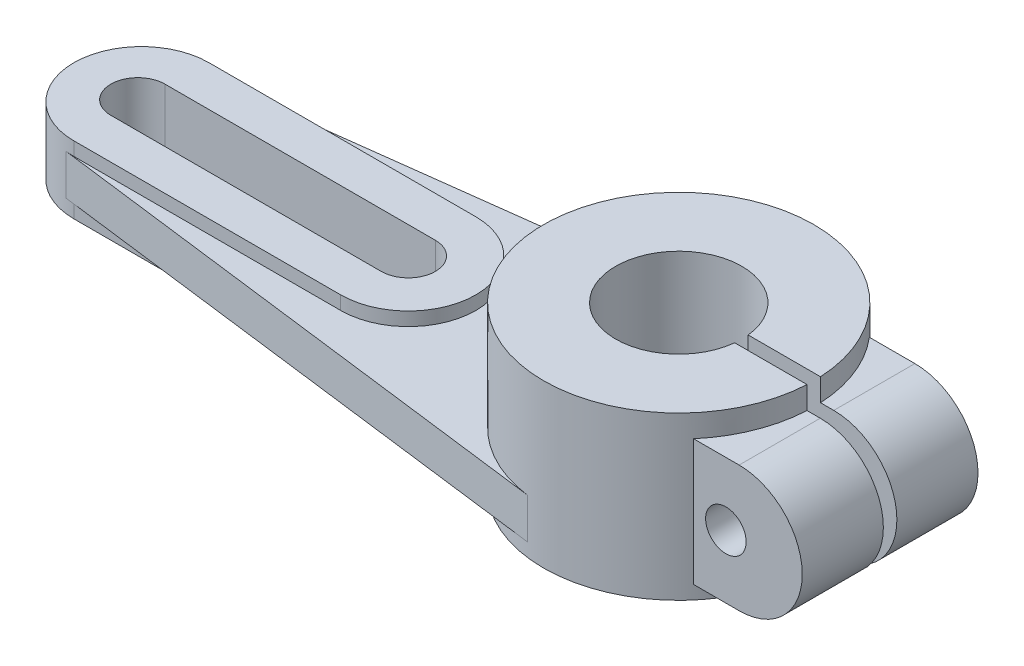
ISO-10303-21;
HEADER;
FILE_DESCRIPTION(('STEP AP214'),'2;1');
FILE_NAME('part.step','',(''),(''),'','','');
FILE_SCHEMA(('AUTOMOTIVE_DESIGN { 1 0 10303 214 1 1 1 1 }'));
ENDSEC;
DATA;
#1=APPLICATION_CONTEXT('core data for automotive mechanical design processes');
#2=APPLICATION_PROTOCOL_DEFINITION('international standard','automotive_design',2000,#1);
#3=PRODUCT_CONTEXT('',#1,'mechanical');
#4=PRODUCT('Part','Part','',(#3));
#5=PRODUCT_RELATED_PRODUCT_CATEGORY('part','',(#4));
#6=PRODUCT_DEFINITION_FORMATION('','',#4);
#7=PRODUCT_DEFINITION_CONTEXT('part definition',#1,'design');
#8=PRODUCT_DEFINITION('design','',#6,#7);
#9=PRODUCT_DEFINITION_SHAPE('','',#8);
#10=(LENGTH_UNIT() NAMED_UNIT(*) SI_UNIT(.MILLI.,.METRE.));
#11=(NAMED_UNIT(*) PLANE_ANGLE_UNIT() SI_UNIT($,.RADIAN.));
#12=(NAMED_UNIT(*) SI_UNIT($,.STERADIAN.) SOLID_ANGLE_UNIT());
#13=UNCERTAINTY_MEASURE_WITH_UNIT(LENGTH_MEASURE(1.E-05),#10,'distance_accuracy_value','');
#14=(GEOMETRIC_REPRESENTATION_CONTEXT(3) GLOBAL_UNCERTAINTY_ASSIGNED_CONTEXT((#13)) GLOBAL_UNIT_ASSIGNED_CONTEXT((#10,
#11,#12)) REPRESENTATION_CONTEXT('',''));
#15=CARTESIAN_POINT('',(0.,0.,0.));
#16=DIRECTION('',(0.,0.,1.));
#17=DIRECTION('',(1.,0.,0.));
#18=AXIS2_PLACEMENT_3D('',#15,#16,#17);
#19=CARTESIAN_POINT('',(32.9021558676946,9.5,-1.5));
#20=DIRECTION('',(0.,0.,1.));
#21=DIRECTION('',(1.,0.,0.));
#22=AXIS2_PLACEMENT_3D('',#19,#20,#21);
#23=CYLINDRICAL_SURFACE('',#22,14.);
#24=DIRECTION('',(0.,0.,1.));
#25=VECTOR('',#24,1.);
#26=CARTESIAN_POINT('',(32.9021558676946,23.5,0.));
#27=LINE('',#26,#25);
#28=CARTESIAN_POINT('',(32.9021558676946,23.5,-1.5));
#29=VERTEX_POINT('',#28);
#30=CARTESIAN_POINT('',(32.9021558676946,23.5,-19.5));
#31=VERTEX_POINT('',#30);
#32=EDGE_CURVE('E501',#29,#31,#27,.F.);
#33=ORIENTED_EDGE('',*,*,#32,.F.);
#34=CARTESIAN_POINT('',(32.9021558676946,9.5,-1.5));
#35=DIRECTION('',(0.,0.,-1.));
#36=DIRECTION('',(-1.,0.,0.));
#37=AXIS2_PLACEMENT_3D('',#34,#35,#36);
#38=CIRCLE('',#37,14.);
#39=CARTESIAN_POINT('',(32.9021558676946,-4.5,-1.5));
#40=VERTEX_POINT('',#39);
#41=EDGE_CURVE('E48',#40,#29,#38,.F.);
#42=ORIENTED_EDGE('',*,*,#41,.F.);
#43=DIRECTION('',(0.,0.,-1.));
#44=VECTOR('',#43,1.);
#45=CARTESIAN_POINT('',(32.9021558676946,-4.5,-1.5));
#46=LINE('',#45,#44);
#47=CARTESIAN_POINT('',(32.9021558676946,-4.5,-19.5));
#48=VERTEX_POINT('',#47);
#49=EDGE_CURVE('E505',#48,#40,#46,.F.);
#50=ORIENTED_EDGE('',*,*,#49,.F.);
#51=CARTESIAN_POINT('',(32.9021558676946,9.5,-19.5));
#52=DIRECTION('',(0.,0.,-1.));
#53=DIRECTION('',(-1.,0.,0.));
#54=AXIS2_PLACEMENT_3D('',#51,#52,#53);
#55=CIRCLE('',#54,14.);
#56=EDGE_CURVE('E11',#31,#48,#55,.T.);
#57=ORIENTED_EDGE('',*,*,#56,.F.);
#58=EDGE_LOOP('',(#33,#42,#50,#57));
#59=FACE_BOUND('',#58,.T.);
#60=ADVANCED_FACE('F38',(#59),#23,.T.);
#61=CARTESIAN_POINT('',(32.9021558676946,9.5,19.5));
#62=DIRECTION('',(0.,0.,-1.));
#63=DIRECTION('',(-1.,0.,0.));
#64=AXIS2_PLACEMENT_3D('',#61,#62,#63);
#65=CYLINDRICAL_SURFACE('',#64,14.);
#66=DIRECTION('',(0.,0.,1.));
#67=VECTOR('',#66,1.);
#68=CARTESIAN_POINT('',(32.9021558676946,23.5,19.5));
#69=LINE('',#68,#67);
#70=CARTESIAN_POINT('',(32.9021558676946,23.5,19.5));
#71=VERTEX_POINT('',#70);
#72=CARTESIAN_POINT('',(32.9021558676946,23.5,1.5));
#73=VERTEX_POINT('',#72);
#74=EDGE_CURVE('E476',#71,#73,#69,.F.);
#75=ORIENTED_EDGE('',*,*,#74,.F.);
#76=CARTESIAN_POINT('',(32.9021558676946,9.5,19.5));
#77=DIRECTION('',(0.,0.,-1.));
#78=DIRECTION('',(-1.,0.,0.));
#79=AXIS2_PLACEMENT_3D('',#76,#77,#78);
#80=CIRCLE('',#79,14.);
#81=CARTESIAN_POINT('',(32.9021558676946,-4.5,19.5));
#82=VERTEX_POINT('',#81);
#83=EDGE_CURVE('E495',#82,#71,#80,.F.);
#84=ORIENTED_EDGE('',*,*,#83,.F.);
#85=DIRECTION('',(0.,0.,-1.));
#86=VECTOR('',#85,1.);
#87=CARTESIAN_POINT('',(32.9021558676946,-4.5,0.));
#88=LINE('',#87,#86);
#89=CARTESIAN_POINT('',(32.9021558676946,-4.5,1.5));
#90=VERTEX_POINT('',#89);
#91=EDGE_CURVE('E491',#90,#82,#88,.F.);
#92=ORIENTED_EDGE('',*,*,#91,.F.);
#93=CARTESIAN_POINT('',(32.9021558676946,9.5,1.5));
#94=DIRECTION('',(0.,0.,-1.));
#95=DIRECTION('',(-1.,0.,0.));
#96=AXIS2_PLACEMENT_3D('',#93,#94,#95);
#97=CIRCLE('',#96,14.);
#98=EDGE_CURVE('E498',#73,#90,#97,.T.);
#99=ORIENTED_EDGE('',*,*,#98,.F.);
#100=EDGE_LOOP('',(#75,#84,#92,#99));
#101=FACE_BOUND('',#100,.T.);
#102=ADVANCED_FACE('F555',(#101),#65,.T.);
#103=CARTESIAN_POINT('',(0.,7.5,15.));
#104=DIRECTION('',(0.,0.,-1.));
#105=DIRECTION('',(-1.,0.,0.));
#106=AXIS2_PLACEMENT_3D('',#103,#104,#105);
#107=PLANE('',#106);
#108=DIRECTION('',(1.,0.,0.));
#109=VECTOR('',#108,1.);
#110=CARTESIAN_POINT('',(0.,-4.5,15.));
#111=LINE('',#110,#109);
#112=CARTESIAN_POINT('',(-119.213164549929,-4.5,15.));
#113=VERTEX_POINT('',#112);
#114=CARTESIAN_POINT('',(-60.,-4.5,15.));
#115=VERTEX_POINT('',#114);
#116=EDGE_CURVE('E358',#113,#115,#111,.T.);
#117=ORIENTED_EDGE('',*,*,#116,.F.);
#118=DIRECTION('',(0.,-1.,0.));
#119=VECTOR('',#118,1.);
#120=CARTESIAN_POINT('',(-119.213164549929,7.5,15.));
#121=LINE('',#120,#119);
#122=CARTESIAN_POINT('',(-119.213164549929,-7.5,15.));
#123=VERTEX_POINT('',#122);
#124=EDGE_CURVE('E461',#113,#123,#121,.T.);
#125=ORIENTED_EDGE('',*,*,#124,.T.);
#126=DIRECTION('',(1.,0.,0.));
#127=VECTOR('',#126,1.);
#128=CARTESIAN_POINT('',(0.,-7.5,15.));
#129=LINE('',#128,#127);
#130=CARTESIAN_POINT('',(-60.,-7.5,15.));
#131=VERTEX_POINT('',#130);
#132=EDGE_CURVE('E441',#123,#131,#129,.T.);
#133=ORIENTED_EDGE('',*,*,#132,.T.);
#134=DIRECTION('',(0.,-1.,0.));
#135=VECTOR('',#134,1.);
#136=CARTESIAN_POINT('',(-60.,7.5,15.));
#137=LINE('',#136,#135);
#138=EDGE_CURVE('E471',#115,#131,#137,.T.);
#139=ORIENTED_EDGE('',*,*,#138,.F.);
#140=EDGE_LOOP('',(#117,#125,#133,#139));
#141=FACE_BOUND('',#140,.T.);
#142=ADVANCED_FACE('F559',(#141),#107,.F.);
#143=CARTESIAN_POINT('',(-60.,7.5,0.));
#144=DIRECTION('',(0.,-1.,0.));
#145=DIRECTION('',(0.,0.,-1.));
#146=AXIS2_PLACEMENT_3D('',#143,#144,#145);
#147=CYLINDRICAL_SURFACE('',#146,15.);
#148=CARTESIAN_POINT('',(-60.,-4.5,0.));
#149=DIRECTION('',(0.,1.,0.));
#150=DIRECTION('',(0.,0.,1.));
#151=AXIS2_PLACEMENT_3D('',#148,#149,#150);
#152=CIRCLE('',#151,15.);
#153=CARTESIAN_POINT('',(-60.,-4.5,-15.));
#154=VERTEX_POINT('',#153);
#155=EDGE_CURVE('E316',#115,#154,#152,.T.);
#156=ORIENTED_EDGE('',*,*,#155,.F.);
#157=ORIENTED_EDGE('',*,*,#138,.T.);
#158=CARTESIAN_POINT('',(-60.,-7.5,0.));
#159=DIRECTION('',(0.,1.,0.));
#160=DIRECTION('',(0.,0.,1.));
#161=AXIS2_PLACEMENT_3D('',#158,#159,#160);
#162=CIRCLE('',#161,15.);
#163=CARTESIAN_POINT('',(-60.,-7.5,-15.));
#164=VERTEX_POINT('',#163);
#165=EDGE_CURVE('E445',#131,#164,#162,.T.);
#166=ORIENTED_EDGE('',*,*,#165,.T.);
#167=DIRECTION('',(0.,-1.,0.));
#168=VECTOR('',#167,1.);
#169=CARTESIAN_POINT('',(-60.,7.5,-15.));
#170=LINE('',#169,#168);
#171=EDGE_CURVE('E466',#154,#164,#170,.T.);
#172=ORIENTED_EDGE('',*,*,#171,.F.);
#173=EDGE_LOOP('',(#156,#157,#166,#172));
#174=FACE_BOUND('',#173,.T.);
#175=ADVANCED_FACE('F564',(#174),#147,.T.);
#176=CARTESIAN_POINT('',(0.,7.5,-15.));
#177=DIRECTION('',(0.,0.,-1.));
#178=DIRECTION('',(-1.,0.,0.));
#179=AXIS2_PLACEMENT_3D('',#176,#177,#178);
#180=PLANE('',#179);
#181=DIRECTION('',(0.,-1.,0.));
#182=VECTOR('',#181,1.);
#183=CARTESIAN_POINT('',(-119.213164549929,7.5,-15.));
#184=LINE('',#183,#182);
#185=CARTESIAN_POINT('',(-119.213164549929,-4.5,-15.));
#186=VERTEX_POINT('',#185);
#187=CARTESIAN_POINT('',(-119.213164549929,-7.5,-15.));
#188=VERTEX_POINT('',#187);
#189=EDGE_CURVE('E460',#186,#188,#184,.T.);
#190=ORIENTED_EDGE('',*,*,#189,.F.);
#191=DIRECTION('',(1.,0.,0.));
#192=VECTOR('',#191,1.);
#193=CARTESIAN_POINT('',(0.,-4.5,-15.));
#194=LINE('',#193,#192);
#195=EDGE_CURVE('E332',#186,#154,#194,.T.);
#196=ORIENTED_EDGE('',*,*,#195,.T.);
#197=ORIENTED_EDGE('',*,*,#171,.T.);
#198=DIRECTION('',(1.,0.,0.));
#199=VECTOR('',#198,1.);
#200=CARTESIAN_POINT('',(0.,-7.5,-15.));
#201=LINE('',#200,#199);
#202=EDGE_CURVE('E449',#188,#164,#201,.T.);
#203=ORIENTED_EDGE('',*,*,#202,.F.);
#204=EDGE_LOOP('',(#190,#196,#197,#203));
#205=FACE_BOUND('',#204,.T.);
#206=ADVANCED_FACE('F593',(#205),#180,.T.);
#207=CARTESIAN_POINT('',(-119.213164549929,7.5,15.));
#208=VERTEX_POINT('',#207);
#209=CARTESIAN_POINT('',(-119.213164549929,4.5,15.));
#210=VERTEX_POINT('',#209);
#211=EDGE_CURVE('E456',#208,#210,#121,.T.);
#212=ORIENTED_EDGE('',*,*,#211,.T.);
#213=DIRECTION('',(1.,0.,0.));
#214=VECTOR('',#213,1.);
#215=CARTESIAN_POINT('',(0.,4.5,15.));
#216=LINE('',#215,#214);
#217=CARTESIAN_POINT('',(-60.,4.5,15.));
#218=VERTEX_POINT('',#217);
#219=EDGE_CURVE('E331',#210,#218,#216,.T.);
#220=ORIENTED_EDGE('',*,*,#219,.T.);
#221=CARTESIAN_POINT('',(-60.,7.5,15.));
#222=VERTEX_POINT('',#221);
#223=EDGE_CURVE('E472',#222,#218,#137,.T.);
#224=ORIENTED_EDGE('',*,*,#223,.F.);
#225=DIRECTION('',(1.,0.,0.));
#226=VECTOR('',#225,1.);
#227=CARTESIAN_POINT('',(0.,7.5,15.));
#228=LINE('',#227,#226);
#229=EDGE_CURVE('E411',#208,#222,#228,.T.);
#230=ORIENTED_EDGE('',*,*,#229,.F.);
#231=EDGE_LOOP('',(#212,#220,#224,#230));
#232=FACE_BOUND('',#231,.T.);
#233=ADVANCED_FACE('F567',(#232),#107,.F.);
#234=ORIENTED_EDGE('',*,*,#223,.T.);
#235=CARTESIAN_POINT('',(-60.,4.5,0.));
#236=DIRECTION('',(0.,1.,0.));
#237=DIRECTION('',(0.,0.,1.));
#238=AXIS2_PLACEMENT_3D('',#235,#236,#237);
#239=CIRCLE('',#238,15.);
#240=CARTESIAN_POINT('',(-60.,4.5,-15.));
#241=VERTEX_POINT('',#240);
#242=EDGE_CURVE('E328',#218,#241,#239,.T.);
#243=ORIENTED_EDGE('',*,*,#242,.T.);
#244=CARTESIAN_POINT('',(-60.,7.5,-15.));
#245=VERTEX_POINT('',#244);
#246=EDGE_CURVE('E467',#245,#241,#170,.T.);
#247=ORIENTED_EDGE('',*,*,#246,.F.);
#248=CARTESIAN_POINT('',(-60.,7.5,0.));
#249=DIRECTION('',(0.,1.,0.));
#250=DIRECTION('',(0.,0.,1.));
#251=AXIS2_PLACEMENT_3D('',#248,#249,#250);
#252=CIRCLE('',#251,15.);
#253=EDGE_CURVE('E415',#222,#245,#252,.T.);
#254=ORIENTED_EDGE('',*,*,#253,.F.);
#255=EDGE_LOOP('',(#234,#243,#247,#254));
#256=FACE_BOUND('',#255,.T.);
#257=ADVANCED_FACE('F592',(#256),#147,.T.);
#258=DIRECTION('',(1.,0.,0.));
#259=VECTOR('',#258,1.);
#260=CARTESIAN_POINT('',(0.,4.5,-15.));
#261=LINE('',#260,#259);
#262=CARTESIAN_POINT('',(-119.213164549929,4.5,-15.));
#263=VERTEX_POINT('',#262);
#264=EDGE_CURVE('E350',#263,#241,#261,.T.);
#265=ORIENTED_EDGE('',*,*,#264,.F.);
#266=CARTESIAN_POINT('',(-119.213164549929,7.5,-15.));
#267=VERTEX_POINT('',#266);
#268=EDGE_CURVE('E462',#267,#263,#184,.T.);
#269=ORIENTED_EDGE('',*,*,#268,.F.);
#270=DIRECTION('',(1.,0.,0.));
#271=VECTOR('',#270,1.);
#272=CARTESIAN_POINT('',(0.,7.5,-15.));
#273=LINE('',#272,#271);
#274=EDGE_CURVE('E418',#267,#245,#273,.T.);
#275=ORIENTED_EDGE('',*,*,#274,.T.);
#276=ORIENTED_EDGE('',*,*,#246,.T.);
#277=EDGE_LOOP('',(#265,#269,#275,#276));
#278=FACE_BOUND('',#277,.T.);
#279=ADVANCED_FACE('F577',(#278),#180,.T.);
#280=CARTESIAN_POINT('',(-120.,7.5,0.));
#281=DIRECTION('',(0.,-1.,0.));
#282=DIRECTION('',(0.,0.,-1.));
#283=AXIS2_PLACEMENT_3D('',#280,#281,#282);
#284=CYLINDRICAL_SURFACE('',#283,6.);
#285=CARTESIAN_POINT('',(-120.,-7.5,0.));
#286=DIRECTION('',(0.,1.,0.));
#287=DIRECTION('',(0.,0.,1.));
#288=AXIS2_PLACEMENT_3D('',#285,#286,#287);
#289=CIRCLE('',#288,6.);
#290=CARTESIAN_POINT('',(-120.,-7.5,-5.99999999999999));
#291=VERTEX_POINT('',#290);
#292=CARTESIAN_POINT('',(-120.,-7.5,6.00000000000001));
#293=VERTEX_POINT('',#292);
#294=EDGE_CURVE('E394',#291,#293,#289,.T.);
#295=ORIENTED_EDGE('',*,*,#294,.F.);
#296=DIRECTION('',(0.,-1.,0.));
#297=VECTOR('',#296,1.);
#298=CARTESIAN_POINT('',(-120.,7.5,-5.99999999999999));
#299=LINE('',#298,#297);
#300=CARTESIAN_POINT('',(-120.,7.5,-5.99999999999999));
#301=VERTEX_POINT('',#300);
#302=EDGE_CURVE('E485',#301,#291,#299,.T.);
#303=ORIENTED_EDGE('',*,*,#302,.F.);
#304=CARTESIAN_POINT('',(-120.,7.5,0.));
#305=DIRECTION('',(0.,1.,0.));
#306=DIRECTION('',(0.,0.,1.));
#307=AXIS2_PLACEMENT_3D('',#304,#305,#306);
#308=CIRCLE('',#307,6.);
#309=CARTESIAN_POINT('',(-120.,7.5,6.00000000000001));
#310=VERTEX_POINT('',#309);
#311=EDGE_CURVE('E395',#301,#310,#308,.T.);
#312=ORIENTED_EDGE('',*,*,#311,.T.);
#313=DIRECTION('',(0.,-1.,0.));
#314=VECTOR('',#313,1.);
#315=CARTESIAN_POINT('',(-120.,7.5,6.00000000000001));
#316=LINE('',#315,#314);
#317=EDGE_CURVE('E425',#310,#293,#316,.T.);
#318=ORIENTED_EDGE('',*,*,#317,.T.);
#319=EDGE_LOOP('',(#295,#303,#312,#318));
#320=FACE_BOUND('',#319,.T.);
#321=ADVANCED_FACE('F573',(#320),#284,.F.);
#322=CARTESIAN_POINT('',(0.,7.5,-6.00000000000001));
#323=DIRECTION('',(0.,0.,1.));
#324=DIRECTION('',(1.,0.,0.));
#325=AXIS2_PLACEMENT_3D('',#322,#323,#324);
#326=PLANE('',#325);
#327=DIRECTION('',(-1.,0.,0.));
#328=VECTOR('',#327,1.);
#329=CARTESIAN_POINT('',(0.,-7.5,-6.00000000000001));
#330=LINE('',#329,#328);
#331=CARTESIAN_POINT('',(-60.,-7.5,-6.));
#332=VERTEX_POINT('',#331);
#333=EDGE_CURVE('E429',#332,#291,#330,.T.);
#334=ORIENTED_EDGE('',*,*,#333,.F.);
#335=DIRECTION('',(0.,-1.,0.));
#336=VECTOR('',#335,1.);
#337=CARTESIAN_POINT('',(-60.,7.5,-6.));
#338=LINE('',#337,#336);
#339=CARTESIAN_POINT('',(-60.,7.5,-6.));
#340=VERTEX_POINT('',#339);
#341=EDGE_CURVE('E482',#340,#332,#338,.T.);
#342=ORIENTED_EDGE('',*,*,#341,.F.);
#343=DIRECTION('',(-1.,0.,0.));
#344=VECTOR('',#343,1.);
#345=CARTESIAN_POINT('',(0.,7.5,-6.00000000000001));
#346=LINE('',#345,#344);
#347=EDGE_CURVE('E399',#340,#301,#346,.T.);
#348=ORIENTED_EDGE('',*,*,#347,.T.);
#349=ORIENTED_EDGE('',*,*,#302,.T.);
#350=EDGE_LOOP('',(#334,#342,#348,#349));
#351=FACE_BOUND('',#350,.T.);
#352=ADVANCED_FACE('F576',(#351),#326,.T.);
#353=CARTESIAN_POINT('',(-60.,7.5,0.));
#354=DIRECTION('',(0.,-1.,0.));
#355=DIRECTION('',(0.,0.,-1.));
#356=AXIS2_PLACEMENT_3D('',#353,#354,#355);
#357=CYLINDRICAL_SURFACE('',#356,6.);
#358=CARTESIAN_POINT('',(-60.,-7.5,0.));
#359=DIRECTION('',(0.,1.,0.));
#360=DIRECTION('',(0.,0.,1.));
#361=AXIS2_PLACEMENT_3D('',#358,#359,#360);
#362=CIRCLE('',#361,6.);
#363=CARTESIAN_POINT('',(-60.,-7.5,6.));
#364=VERTEX_POINT('',#363);
#365=EDGE_CURVE('E433',#364,#332,#362,.T.);
#366=ORIENTED_EDGE('',*,*,#365,.F.);
#367=DIRECTION('',(0.,-1.,0.));
#368=VECTOR('',#367,1.);
#369=CARTESIAN_POINT('',(-60.,7.5,6.));
#370=LINE('',#369,#368);
#371=CARTESIAN_POINT('',(-60.,7.5,6.));
#372=VERTEX_POINT('',#371);
#373=EDGE_CURVE('E479',#372,#364,#370,.T.);
#374=ORIENTED_EDGE('',*,*,#373,.F.);
#375=CARTESIAN_POINT('',(-60.,7.5,0.));
#376=DIRECTION('',(0.,1.,0.));
#377=DIRECTION('',(0.,0.,1.));
#378=AXIS2_PLACEMENT_3D('',#375,#376,#377);
#379=CIRCLE('',#378,6.);
#380=EDGE_CURVE('E404',#372,#340,#379,.T.);
#381=ORIENTED_EDGE('',*,*,#380,.T.);
#382=ORIENTED_EDGE('',*,*,#341,.T.);
#383=EDGE_LOOP('',(#366,#374,#381,#382));
#384=FACE_BOUND('',#383,.T.);
#385=ADVANCED_FACE('F581',(#384),#357,.F.);
#386=CARTESIAN_POINT('',(0.,7.5,5.99999999999999));
#387=DIRECTION('',(0.,0.,1.));
#388=DIRECTION('',(1.,0.,0.));
#389=AXIS2_PLACEMENT_3D('',#386,#387,#388);
#390=PLANE('',#389);
#391=DIRECTION('',(-1.,0.,0.));
#392=VECTOR('',#391,1.);
#393=CARTESIAN_POINT('',(0.,-7.5,5.99999999999999));
#394=LINE('',#393,#392);
#395=EDGE_CURVE('E437',#364,#293,#394,.T.);
#396=ORIENTED_EDGE('',*,*,#395,.T.);
#397=ORIENTED_EDGE('',*,*,#317,.F.);
#398=DIRECTION('',(-1.,0.,0.));
#399=VECTOR('',#398,1.);
#400=CARTESIAN_POINT('',(0.,7.5,5.99999999999999));
#401=LINE('',#400,#399);
#402=EDGE_CURVE('E408',#372,#310,#401,.T.);
#403=ORIENTED_EDGE('',*,*,#402,.F.);
#404=ORIENTED_EDGE('',*,*,#373,.T.);
#405=EDGE_LOOP('',(#396,#397,#403,#404));
#406=FACE_BOUND('',#405,.T.);
#407=ADVANCED_FACE('F585',(#406),#390,.F.);
#408=CARTESIAN_POINT('',(-119.213164549929,7.5,0.));
#409=DIRECTION('',(0.,-1.,0.));
#410=DIRECTION('',(0.,0.,-1.));
#411=AXIS2_PLACEMENT_3D('',#408,#409,#410);
#412=CYLINDRICAL_SURFACE('',#411,15.);
#413=ORIENTED_EDGE('',*,*,#268,.T.);
#414=CARTESIAN_POINT('',(-119.213164549929,4.5,0.));
#415=DIRECTION('',(0.,1.,0.));
#416=DIRECTION('',(0.,0.,1.));
#417=AXIS2_PLACEMENT_3D('',#414,#415,#416);
#418=CIRCLE('',#417,15.);
#419=CARTESIAN_POINT('',(-121.100539999188,4.5,-14.880786737049));
#420=VERTEX_POINT('',#419);
#421=EDGE_CURVE('E339',#263,#420,#418,.T.);
#422=ORIENTED_EDGE('',*,*,#421,.T.);
#423=DIRECTION('',(0.,-1.,0.));
#424=VECTOR('',#423,1.);
#425=CARTESIAN_POINT('',(-121.100539999188,4.5,-14.880786737049));
#426=LINE('',#425,#424);
#427=CARTESIAN_POINT('',(-121.100539999188,-4.5,-14.880786737049));
#428=VERTEX_POINT('',#427);
#429=EDGE_CURVE('E354',#420,#428,#426,.T.);
#430=ORIENTED_EDGE('',*,*,#429,.T.);
#431=CARTESIAN_POINT('',(-119.213164549929,-4.5,0.));
#432=DIRECTION('',(0.,1.,0.));
#433=DIRECTION('',(0.,0.,1.));
#434=AXIS2_PLACEMENT_3D('',#431,#432,#433);
#435=CIRCLE('',#434,15.);
#436=EDGE_CURVE('E367',#186,#428,#435,.T.);
#437=ORIENTED_EDGE('',*,*,#436,.F.);
#438=ORIENTED_EDGE('',*,*,#189,.T.);
#439=CARTESIAN_POINT('',(-119.213164549929,-7.5,0.));
#440=DIRECTION('',(0.,1.,0.));
#441=DIRECTION('',(0.,0.,1.));
#442=AXIS2_PLACEMENT_3D('',#439,#440,#441);
#443=CIRCLE('',#442,15.);
#444=EDGE_CURVE('E400',#188,#123,#443,.T.);
#445=ORIENTED_EDGE('',*,*,#444,.T.);
#446=ORIENTED_EDGE('',*,*,#124,.F.);
#447=CARTESIAN_POINT('',(-121.100539999188,-4.5,14.880786737049));
#448=VERTEX_POINT('',#447);
#449=EDGE_CURVE('E362',#448,#113,#435,.T.);
#450=ORIENTED_EDGE('',*,*,#449,.F.);
#451=DIRECTION('',(0.,-1.,0.));
#452=VECTOR('',#451,1.);
#453=CARTESIAN_POINT('',(-121.100539999188,4.5,14.880786737049));
#454=LINE('',#453,#452);
#455=CARTESIAN_POINT('',(-121.100539999188,4.5,14.880786737049));
#456=VERTEX_POINT('',#455);
#457=EDGE_CURVE('E390',#456,#448,#454,.T.);
#458=ORIENTED_EDGE('',*,*,#457,.F.);
#459=EDGE_CURVE('E335',#456,#210,#418,.T.);
#460=ORIENTED_EDGE('',*,*,#459,.T.);
#461=ORIENTED_EDGE('',*,*,#211,.F.);
#462=CARTESIAN_POINT('',(-119.213164549929,7.5,0.));
#463=DIRECTION('',(0.,1.,0.));
#464=DIRECTION('',(0.,0.,1.));
#465=AXIS2_PLACEMENT_3D('',#462,#463,#464);
#466=CIRCLE('',#465,15.);
#467=EDGE_CURVE('E422',#267,#208,#466,.T.);
#468=ORIENTED_EDGE('',*,*,#467,.F.);
#469=EDGE_LOOP('',(#413,#422,#430,#437,#438,#445,#446,#450,#458,#460,#461,#468));
#470=FACE_BOUND('',#469,.T.);
#471=ADVANCED_FACE('F588',(#470),#412,.T.);
#472=CARTESIAN_POINT('',(0.,7.5,0.));
#473=DIRECTION('',(0.,1.,0.));
#474=DIRECTION('',(0.,0.,1.));
#475=AXIS2_PLACEMENT_3D('',#472,#473,#474);
#476=PLANE('',#475);
#477=ORIENTED_EDGE('',*,*,#311,.F.);
#478=ORIENTED_EDGE('',*,*,#347,.F.);
#479=ORIENTED_EDGE('',*,*,#380,.F.);
#480=ORIENTED_EDGE('',*,*,#402,.T.);
#481=EDGE_LOOP('',(#477,#478,#479,#480));
#482=FACE_BOUND('',#481,.T.);
#483=ORIENTED_EDGE('',*,*,#229,.T.);
#484=ORIENTED_EDGE('',*,*,#253,.T.);
#485=ORIENTED_EDGE('',*,*,#274,.F.);
#486=ORIENTED_EDGE('',*,*,#467,.T.);
#487=EDGE_LOOP('',(#483,#484,#485,#486));
#488=FACE_BOUND('',#487,.T.);
#489=ADVANCED_FACE('F603',(#482,#488),#476,.T.);
#490=CARTESIAN_POINT('',(0.,-7.5,0.));
#491=DIRECTION('',(0.,1.,0.));
#492=DIRECTION('',(0.,0.,1.));
#493=AXIS2_PLACEMENT_3D('',#490,#491,#492);
#494=PLANE('',#493);
#495=ORIENTED_EDGE('',*,*,#294,.T.);
#496=ORIENTED_EDGE('',*,*,#395,.F.);
#497=ORIENTED_EDGE('',*,*,#365,.T.);
#498=ORIENTED_EDGE('',*,*,#333,.T.);
#499=EDGE_LOOP('',(#495,#496,#497,#498));
#500=FACE_BOUND('',#499,.T.);
#501=ORIENTED_EDGE('',*,*,#132,.F.);
#502=ORIENTED_EDGE('',*,*,#444,.F.);
#503=ORIENTED_EDGE('',*,*,#202,.T.);
#504=ORIENTED_EDGE('',*,*,#165,.F.);
#505=EDGE_LOOP('',(#501,#502,#503,#504));
#506=FACE_BOUND('',#505,.T.);
#507=ADVANCED_FACE('F605',(#500,#506),#494,.F.);
#508=CARTESIAN_POINT('',(-3.77475089851783,4.5,29.7615734740981));
#509=DIRECTION('',(0.125825029950594,0.,-0.992052449136603));
#510=DIRECTION('',(-0.992052449136603,0.,-0.125825029950594));
#511=AXIS2_PLACEMENT_3D('',#508,#509,#510);
#512=PLANE('',#511);
#513=DIRECTION('',(0.992052449136603,0.,0.125825029950594));
#514=VECTOR('',#513,1.);
#515=CARTESIAN_POINT('',(-3.77475089851783,-4.5,29.7615734740981));
#516=LINE('',#515,#514);
#517=CARTESIAN_POINT('',(-3.77475089851783,-4.5,29.7615734740981));
#518=VERTEX_POINT('',#517);
#519=EDGE_CURVE('E366',#448,#518,#516,.T.);
#520=ORIENTED_EDGE('',*,*,#519,.T.);
#521=DIRECTION('',(0.,-1.,0.));
#522=VECTOR('',#521,1.);
#523=CARTESIAN_POINT('',(-3.77475089851783,4.5,29.7615734740981));
#524=LINE('',#523,#522);
#525=CARTESIAN_POINT('',(-3.77475089851783,4.5,29.7615734740981));
#526=VERTEX_POINT('',#525);
#527=EDGE_CURVE('E387',#526,#518,#524,.T.);
#528=ORIENTED_EDGE('',*,*,#527,.F.);
#529=DIRECTION('',(0.992052449136603,0.,0.125825029950594));
#530=VECTOR('',#529,1.);
#531=CARTESIAN_POINT('',(-3.77475089851783,4.5,29.7615734740981));
#532=LINE('',#531,#530);
#533=EDGE_CURVE('E338',#456,#526,#532,.T.);
#534=ORIENTED_EDGE('',*,*,#533,.F.);
#535=ORIENTED_EDGE('',*,*,#457,.T.);
#536=EDGE_LOOP('',(#520,#528,#534,#535));
#537=FACE_BOUND('',#536,.T.);
#538=ADVANCED_FACE('F608',(#537),#512,.F.);
#539=CARTESIAN_POINT('',(-3.77475089851783,4.5,-29.7615734740981));
#540=DIRECTION('',(-0.125825029950594,0.,-0.992052449136603));
#541=DIRECTION('',(-0.992052449136603,0.,0.125825029950594));
#542=AXIS2_PLACEMENT_3D('',#539,#540,#541);
#543=PLANE('',#542);
#544=DIRECTION('',(0.992052449136603,0.,-0.125825029950594));
#545=VECTOR('',#544,1.);
#546=CARTESIAN_POINT('',(-3.77475089851783,-4.5,-29.7615734740981));
#547=LINE('',#546,#545);
#548=CARTESIAN_POINT('',(-3.77475089851783,-4.5,-29.7615734740981));
#549=VERTEX_POINT('',#548);
#550=EDGE_CURVE('E375',#428,#549,#547,.T.);
#551=ORIENTED_EDGE('',*,*,#550,.F.);
#552=ORIENTED_EDGE('',*,*,#429,.F.);
#553=DIRECTION('',(0.992052449136603,0.,-0.125825029950594));
#554=VECTOR('',#553,1.);
#555=CARTESIAN_POINT('',(-3.77475089851783,4.5,-29.7615734740981));
#556=LINE('',#555,#554);
#557=CARTESIAN_POINT('',(-3.77475089851783,4.5,-29.7615734740981));
#558=VERTEX_POINT('',#557);
#559=EDGE_CURVE('E346',#420,#558,#556,.T.);
#560=ORIENTED_EDGE('',*,*,#559,.T.);
#561=DIRECTION('',(0.,-1.,0.));
#562=VECTOR('',#561,1.);
#563=CARTESIAN_POINT('',(-3.77475089851783,4.5,-29.7615734740981));
#564=LINE('',#563,#562);
#565=EDGE_CURVE('E383',#558,#549,#564,.T.);
#566=ORIENTED_EDGE('',*,*,#565,.T.);
#567=EDGE_LOOP('',(#551,#552,#560,#566));
#568=FACE_BOUND('',#567,.T.);
#569=ADVANCED_FACE('F615',(#568),#543,.T.);
#570=CARTESIAN_POINT('',(0.,4.5,0.));
#571=DIRECTION('',(0.,1.,0.));
#572=DIRECTION('',(0.,0.,1.));
#573=AXIS2_PLACEMENT_3D('',#570,#571,#572);
#574=PLANE('',#573);
#575=ORIENTED_EDGE('',*,*,#242,.F.);
#576=ORIENTED_EDGE('',*,*,#219,.F.);
#577=ORIENTED_EDGE('',*,*,#459,.F.);
#578=ORIENTED_EDGE('',*,*,#533,.T.);
#579=CARTESIAN_POINT('',(0.,4.5,0.));
#580=DIRECTION('',(0.,1.,0.));
#581=DIRECTION('',(0.,0.,1.));
#582=AXIS2_PLACEMENT_3D('',#579,#580,#581);
#583=CIRCLE('',#582,30.);
#584=EDGE_CURVE('E343',#558,#526,#583,.T.);
#585=ORIENTED_EDGE('',*,*,#584,.F.);
#586=ORIENTED_EDGE('',*,*,#559,.F.);
#587=ORIENTED_EDGE('',*,*,#421,.F.);
#588=ORIENTED_EDGE('',*,*,#264,.T.);
#589=EDGE_LOOP('',(#575,#576,#577,#578,#585,#586,#587,#588));
#590=FACE_BOUND('',#589,.T.);
#591=ADVANCED_FACE('F619',(#590),#574,.T.);
#592=CARTESIAN_POINT('',(0.,-4.5,0.));
#593=DIRECTION('',(0.,1.,0.));
#594=DIRECTION('',(0.,0.,1.));
#595=AXIS2_PLACEMENT_3D('',#592,#593,#594);
#596=PLANE('',#595);
#597=ORIENTED_EDGE('',*,*,#155,.T.);
#598=ORIENTED_EDGE('',*,*,#195,.F.);
#599=ORIENTED_EDGE('',*,*,#436,.T.);
#600=ORIENTED_EDGE('',*,*,#550,.T.);
#601=CARTESIAN_POINT('',(0.,-4.5,0.));
#602=DIRECTION('',(0.,1.,0.));
#603=DIRECTION('',(0.,0.,1.));
#604=AXIS2_PLACEMENT_3D('',#601,#602,#603);
#605=CIRCLE('',#604,30.);
#606=EDGE_CURVE('E371',#549,#518,#605,.T.);
#607=ORIENTED_EDGE('',*,*,#606,.T.);
#608=ORIENTED_EDGE('',*,*,#519,.F.);
#609=ORIENTED_EDGE('',*,*,#449,.T.);
#610=ORIENTED_EDGE('',*,*,#116,.T.);
#611=EDGE_LOOP('',(#597,#598,#599,#600,#607,#608,#609,#610));
#612=FACE_BOUND('',#611,.T.);
#613=ADVANCED_FACE('F621',(#612),#596,.F.);
#614=CARTESIAN_POINT('',(0.,28.5,0.));
#615=DIRECTION('',(0.,-1.,0.));
#616=DIRECTION('',(0.,0.,-1.));
#617=AXIS2_PLACEMENT_3D('',#614,#615,#616);
#618=CYLINDRICAL_SURFACE('',#617,14.);
#619=CARTESIAN_POINT('',(0.,-7.5,0.));
#620=DIRECTION('',(0.,1.,0.));
#621=DIRECTION('',(0.,0.,1.));
#622=AXIS2_PLACEMENT_3D('',#619,#620,#621);
#623=CIRCLE('',#622,14.);
#624=CARTESIAN_POINT('',(13.9194109070751,-7.5,-1.5));
#625=VERTEX_POINT('',#624);
#626=CARTESIAN_POINT('',(13.9194109070751,-7.5,1.5));
#627=VERTEX_POINT('',#626);
#628=EDGE_CURVE('E282',#625,#627,#623,.T.);
#629=ORIENTED_EDGE('',*,*,#628,.F.);
#630=DIRECTION('',(0.,-1.,0.));
#631=VECTOR('',#630,1.);
#632=CARTESIAN_POINT('',(13.9194109070751,28.5,-1.5));
#633=LINE('',#632,#631);
#634=CARTESIAN_POINT('',(13.9194109070751,28.5,-1.5));
#635=VERTEX_POINT('',#634);
#636=EDGE_CURVE('E313',#635,#625,#633,.T.);
#637=ORIENTED_EDGE('',*,*,#636,.F.);
#638=CARTESIAN_POINT('',(0.,28.5,0.));
#639=DIRECTION('',(0.,1.,0.));
#640=DIRECTION('',(0.,0.,1.));
#641=AXIS2_PLACEMENT_3D('',#638,#639,#640);
#642=CIRCLE('',#641,14.);
#643=CARTESIAN_POINT('',(13.9194109070751,28.5,1.5));
#644=VERTEX_POINT('',#643);
#645=EDGE_CURVE('E283',#635,#644,#642,.T.);
#646=ORIENTED_EDGE('',*,*,#645,.T.);
#647=DIRECTION('',(0.,-1.,0.));
#648=VECTOR('',#647,1.);
#649=CARTESIAN_POINT('',(13.9194109070751,28.5,1.5));
#650=LINE('',#649,#648);
#651=EDGE_CURVE('E298',#644,#627,#650,.T.);
#652=ORIENTED_EDGE('',*,*,#651,.T.);
#653=EDGE_LOOP('',(#629,#637,#646,#652));
#654=FACE_BOUND('',#653,.T.);
#655=ADVANCED_FACE('F624',(#654),#618,.F.);
#656=CARTESIAN_POINT('',(0.,28.5,-1.5));
#657=DIRECTION('',(0.,0.,-1.));
#658=DIRECTION('',(-1.,0.,0.));
#659=AXIS2_PLACEMENT_3D('',#656,#657,#658);
#660=PLANE('',#659);
#661=CARTESIAN_POINT('',(29.9624765331573,9.50000000000001,-1.5));
#662=DIRECTION('',(0.,0.,-1.));
#663=DIRECTION('',(-1.,0.,0.));
#664=AXIS2_PLACEMENT_3D('',#661,#662,#663);
#665=CIRCLE('',#664,4.5);
#666=CARTESIAN_POINT('',(25.4624765331573,9.50000000000001,-1.5));
#667=VERTEX_POINT('',#666);
#668=EDGE_CURVE('E246',#667,#667,#665,.T.);
#669=ORIENTED_EDGE('',*,*,#668,.T.);
#670=EDGE_LOOP('',(#669));
#671=FACE_BOUND('',#670,.T.);
#672=DIRECTION('',(-1.,0.,0.));
#673=VECTOR('',#672,1.);
#674=CARTESIAN_POINT('',(0.,-4.5,-1.50000000000001));
#675=LINE('',#674,#673);
#676=CARTESIAN_POINT('',(29.9624765331573,-4.5,-1.5));
#677=VERTEX_POINT('',#676);
#678=EDGE_CURVE('E241',#40,#677,#675,.T.);
#679=ORIENTED_EDGE('',*,*,#678,.F.);
#680=ORIENTED_EDGE('',*,*,#41,.T.);
#681=DIRECTION('',(-1.,0.,0.));
#682=VECTOR('',#681,1.);
#683=CARTESIAN_POINT('',(0.,23.5,-1.50000000000001));
#684=LINE('',#683,#682);
#685=CARTESIAN_POINT('',(29.9624765331573,23.5,-1.5));
#686=VERTEX_POINT('',#685);
#687=EDGE_CURVE('E234',#29,#686,#684,.T.);
#688=ORIENTED_EDGE('',*,*,#687,.T.);
#689=DIRECTION('',(0.,-1.,0.));
#690=VECTOR('',#689,1.);
#691=CARTESIAN_POINT('',(29.9624765331573,28.5,-1.5));
#692=LINE('',#691,#690);
#693=CARTESIAN_POINT('',(29.9624765331573,28.5,-1.5));
#694=VERTEX_POINT('',#693);
#695=EDGE_CURVE('E317',#694,#686,#692,.T.);
#696=ORIENTED_EDGE('',*,*,#695,.F.);
#697=DIRECTION('',(1.,0.,0.));
#698=VECTOR('',#697,1.);
#699=CARTESIAN_POINT('',(0.,28.5,-1.5));
#700=LINE('',#699,#698);
#701=EDGE_CURVE('E295',#635,#694,#700,.T.);
#702=ORIENTED_EDGE('',*,*,#701,.F.);
#703=ORIENTED_EDGE('',*,*,#636,.T.);
#704=DIRECTION('',(1.,0.,0.));
#705=VECTOR('',#704,1.);
#706=CARTESIAN_POINT('',(0.,-7.5,-1.5));
#707=LINE('',#706,#705);
#708=CARTESIAN_POINT('',(29.9624765331573,-7.5,-1.5));
#709=VERTEX_POINT('',#708);
#710=EDGE_CURVE('E288',#625,#709,#707,.T.);
#711=ORIENTED_EDGE('',*,*,#710,.T.);
#712=EDGE_CURVE('E320',#677,#709,#692,.T.);
#713=ORIENTED_EDGE('',*,*,#712,.F.);
#714=EDGE_LOOP('',(#679,#680,#688,#696,#702,#703,#711,#713));
#715=FACE_BOUND('',#714,.T.);
#716=ADVANCED_FACE('F511',(#671,#715),#660,.F.);
#717=CARTESIAN_POINT('',(0.,28.5,0.));
#718=DIRECTION('',(0.,-1.,0.));
#719=DIRECTION('',(0.,0.,-1.));
#720=AXIS2_PLACEMENT_3D('',#717,#718,#719);
#721=CYLINDRICAL_SURFACE('',#720,30.);
#722=ORIENTED_EDGE('',*,*,#584,.T.);
#723=ORIENTED_EDGE('',*,*,#527,.T.);
#724=ORIENTED_EDGE('',*,*,#606,.F.);
#725=ORIENTED_EDGE('',*,*,#565,.F.);
#726=EDGE_LOOP('',(#722,#723,#724,#725));
#727=FACE_BOUND('',#726,.T.);
#728=ORIENTED_EDGE('',*,*,#695,.T.);
#729=CARTESIAN_POINT('',(0.,23.5,0.));
#730=DIRECTION('',(0.,1.,0.));
#731=DIRECTION('',(0.,0.,1.));
#732=AXIS2_PLACEMENT_3D('',#729,#730,#731);
#733=CIRCLE('',#732,30.);
#734=CARTESIAN_POINT('',(22.798026230356,23.5,-19.5));
#735=VERTEX_POINT('',#734);
#736=EDGE_CURVE('E230',#686,#735,#733,.T.);
#737=ORIENTED_EDGE('',*,*,#736,.T.);
#738=DIRECTION('',(0.,-1.,0.));
#739=VECTOR('',#738,1.);
#740=CARTESIAN_POINT('',(22.798026230356,23.5,-19.5));
#741=LINE('',#740,#739);
#742=CARTESIAN_POINT('',(22.798026230356,-4.5,-19.5));
#743=VERTEX_POINT('',#742);
#744=EDGE_CURVE('E223',#735,#743,#741,.T.);
#745=ORIENTED_EDGE('',*,*,#744,.T.);
#746=CARTESIAN_POINT('',(0.,-4.5,0.));
#747=DIRECTION('',(0.,1.,0.));
#748=DIRECTION('',(0.,0.,1.));
#749=AXIS2_PLACEMENT_3D('',#746,#747,#748);
#750=CIRCLE('',#749,30.);
#751=EDGE_CURVE('E227',#677,#743,#750,.T.);
#752=ORIENTED_EDGE('',*,*,#751,.F.);
#753=ORIENTED_EDGE('',*,*,#712,.T.);
#754=CARTESIAN_POINT('',(0.,-7.5,0.));
#755=DIRECTION('',(0.,1.,0.));
#756=DIRECTION('',(0.,0.,1.));
#757=AXIS2_PLACEMENT_3D('',#754,#755,#756);
#758=CIRCLE('',#757,30.);
#759=CARTESIAN_POINT('',(29.9624765331573,-7.5,1.49999999999998));
#760=VERTEX_POINT('',#759);
#761=EDGE_CURVE('E306',#709,#760,#758,.T.);
#762=ORIENTED_EDGE('',*,*,#761,.T.);
#763=DIRECTION('',(0.,-1.,0.));
#764=VECTOR('',#763,1.);
#765=CARTESIAN_POINT('',(29.9624765331573,28.5,1.49999999999998));
#766=LINE('',#765,#764);
#767=CARTESIAN_POINT('',(29.9624765331573,-4.5,1.49999999999998));
#768=VERTEX_POINT('',#767);
#769=EDGE_CURVE('E325',#768,#760,#766,.T.);
#770=ORIENTED_EDGE('',*,*,#769,.F.);
#771=CARTESIAN_POINT('',(0.,-4.5,0.));
#772=DIRECTION('',(0.,1.,0.));
#773=DIRECTION('',(0.,0.,1.));
#774=AXIS2_PLACEMENT_3D('',#771,#772,#773);
#775=CIRCLE('',#774,30.);
#776=CARTESIAN_POINT('',(22.798026230356,-4.5,19.5));
#777=VERTEX_POINT('',#776);
#778=EDGE_CURVE('E233',#777,#768,#775,.T.);
#779=ORIENTED_EDGE('',*,*,#778,.F.);
#780=DIRECTION('',(0.,-1.,0.));
#781=VECTOR('',#780,1.);
#782=CARTESIAN_POINT('',(22.798026230356,23.5,19.5));
#783=LINE('',#782,#781);
#784=CARTESIAN_POINT('',(22.798026230356,23.5,19.5));
#785=VERTEX_POINT('',#784);
#786=EDGE_CURVE('E270',#785,#777,#783,.T.);
#787=ORIENTED_EDGE('',*,*,#786,.F.);
#788=CARTESIAN_POINT('',(0.,23.5,0.));
#789=DIRECTION('',(0.,1.,0.));
#790=DIRECTION('',(0.,0.,1.));
#791=AXIS2_PLACEMENT_3D('',#788,#789,#790);
#792=CIRCLE('',#791,30.);
#793=CARTESIAN_POINT('',(29.9624765331573,23.5,1.5));
#794=VERTEX_POINT('',#793);
#795=EDGE_CURVE('E258',#785,#794,#792,.T.);
#796=ORIENTED_EDGE('',*,*,#795,.T.);
#797=CARTESIAN_POINT('',(29.9624765331573,28.5,1.49999999999998));
#798=VERTEX_POINT('',#797);
#799=EDGE_CURVE('E321',#798,#794,#766,.T.);
#800=ORIENTED_EDGE('',*,*,#799,.F.);
#801=CARTESIAN_POINT('',(0.,28.5,0.));
#802=DIRECTION('',(0.,1.,0.));
#803=DIRECTION('',(0.,0.,1.));
#804=AXIS2_PLACEMENT_3D('',#801,#802,#803);
#805=CIRCLE('',#804,30.);
#806=EDGE_CURVE('E292',#694,#798,#805,.T.);
#807=ORIENTED_EDGE('',*,*,#806,.F.);
#808=EDGE_LOOP('',(#728,#737,#745,#752,#753,#762,#770,#779,#787,#796,#800,#807));
#809=FACE_BOUND('',#808,.T.);
#810=ADVANCED_FACE('F225',(#727,#809),#721,.T.);
#811=CARTESIAN_POINT('',(0.,28.5,1.5));
#812=DIRECTION('',(0.,0.,-1.));
#813=DIRECTION('',(-1.,0.,0.));
#814=AXIS2_PLACEMENT_3D('',#811,#812,#813);
#815=PLANE('',#814);
#816=CARTESIAN_POINT('',(29.9624765331573,9.50000000000001,1.49999999999999));
#817=DIRECTION('',(0.,0.,-1.));
#818=DIRECTION('',(-1.,0.,0.));
#819=AXIS2_PLACEMENT_3D('',#816,#817,#818);
#820=CIRCLE('',#819,4.5);
#821=CARTESIAN_POINT('',(25.4624765331573,9.50000000000001,1.49999999999999));
#822=VERTEX_POINT('',#821);
#823=EDGE_CURVE('E251',#822,#822,#820,.T.);
#824=ORIENTED_EDGE('',*,*,#823,.F.);
#825=EDGE_LOOP('',(#824));
#826=FACE_BOUND('',#825,.T.);
#827=DIRECTION('',(-1.,0.,0.));
#828=VECTOR('',#827,1.);
#829=CARTESIAN_POINT('',(0.,23.5,1.5));
#830=LINE('',#829,#828);
#831=EDGE_CURVE('E262',#73,#794,#830,.T.);
#832=ORIENTED_EDGE('',*,*,#831,.F.);
#833=ORIENTED_EDGE('',*,*,#98,.T.);
#834=DIRECTION('',(-1.,0.,0.));
#835=VECTOR('',#834,1.);
#836=CARTESIAN_POINT('',(0.,-4.5,1.5));
#837=LINE('',#836,#835);
#838=EDGE_CURVE('E274',#90,#768,#837,.T.);
#839=ORIENTED_EDGE('',*,*,#838,.T.);
#840=ORIENTED_EDGE('',*,*,#769,.T.);
#841=DIRECTION('',(1.,0.,0.));
#842=VECTOR('',#841,1.);
#843=CARTESIAN_POINT('',(0.,-7.5,1.5));
#844=LINE('',#843,#842);
#845=EDGE_CURVE('E302',#627,#760,#844,.T.);
#846=ORIENTED_EDGE('',*,*,#845,.F.);
#847=ORIENTED_EDGE('',*,*,#651,.F.);
#848=DIRECTION('',(1.,0.,0.));
#849=VECTOR('',#848,1.);
#850=CARTESIAN_POINT('',(0.,28.5,1.5));
#851=LINE('',#850,#849);
#852=EDGE_CURVE('E287',#644,#798,#851,.T.);
#853=ORIENTED_EDGE('',*,*,#852,.T.);
#854=ORIENTED_EDGE('',*,*,#799,.T.);
#855=EDGE_LOOP('',(#832,#833,#839,#840,#846,#847,#853,#854));
#856=FACE_BOUND('',#855,.T.);
#857=ADVANCED_FACE('F632',(#826,#856),#815,.T.);
#858=CARTESIAN_POINT('',(0.,28.5,0.));
#859=DIRECTION('',(0.,1.,0.));
#860=DIRECTION('',(0.,0.,1.));
#861=AXIS2_PLACEMENT_3D('',#858,#859,#860);
#862=PLANE('',#861);
#863=ORIENTED_EDGE('',*,*,#645,.F.);
#864=ORIENTED_EDGE('',*,*,#701,.T.);
#865=ORIENTED_EDGE('',*,*,#806,.T.);
#866=ORIENTED_EDGE('',*,*,#852,.F.);
#867=EDGE_LOOP('',(#863,#864,#865,#866));
#868=FACE_BOUND('',#867,.T.);
#869=ADVANCED_FACE('F635',(#868),#862,.T.);
#870=CARTESIAN_POINT('',(0.,-7.5,0.));
#871=DIRECTION('',(0.,1.,0.));
#872=DIRECTION('',(0.,0.,1.));
#873=AXIS2_PLACEMENT_3D('',#870,#871,#872);
#874=PLANE('',#873);
#875=ORIENTED_EDGE('',*,*,#628,.T.);
#876=ORIENTED_EDGE('',*,*,#845,.T.);
#877=ORIENTED_EDGE('',*,*,#761,.F.);
#878=ORIENTED_EDGE('',*,*,#710,.F.);
#879=EDGE_LOOP('',(#875,#876,#877,#878));
#880=FACE_BOUND('',#879,.T.);
#881=ADVANCED_FACE('F643',(#880),#874,.F.);
#882=CARTESIAN_POINT('',(0.,23.5,19.5));
#883=DIRECTION('',(0.,0.,-1.));
#884=DIRECTION('',(-1.,0.,0.));
#885=AXIS2_PLACEMENT_3D('',#882,#883,#884);
#886=PLANE('',#885);
#887=CARTESIAN_POINT('',(29.9624765331573,9.50000000000001,19.5));
#888=DIRECTION('',(0.,0.,1.));
#889=DIRECTION('',(1.,0.,0.));
#890=AXIS2_PLACEMENT_3D('',#887,#888,#889);
#891=CIRCLE('',#890,4.5);
#892=CARTESIAN_POINT('',(34.4624765331573,9.50000000000001,19.5));
#893=VERTEX_POINT('',#892);
#894=EDGE_CURVE('E527',#893,#893,#891,.T.);
#895=ORIENTED_EDGE('',*,*,#894,.F.);
#896=EDGE_LOOP('',(#895));
#897=FACE_BOUND('',#896,.T.);
#898=DIRECTION('',(1.,0.,0.));
#899=VECTOR('',#898,1.);
#900=CARTESIAN_POINT('',(0.,-4.5,19.5));
#901=LINE('',#900,#899);
#902=EDGE_CURVE('E263',#777,#82,#901,.T.);
#903=ORIENTED_EDGE('',*,*,#902,.T.);
#904=ORIENTED_EDGE('',*,*,#83,.T.);
#905=DIRECTION('',(1.,0.,0.));
#906=VECTOR('',#905,1.);
#907=CARTESIAN_POINT('',(0.,23.5,19.5));
#908=LINE('',#907,#906);
#909=EDGE_CURVE('E266',#785,#71,#908,.T.);
#910=ORIENTED_EDGE('',*,*,#909,.F.);
#911=ORIENTED_EDGE('',*,*,#786,.T.);
#912=EDGE_LOOP('',(#903,#904,#910,#911));
#913=FACE_BOUND('',#912,.T.);
#914=ADVANCED_FACE('F646',(#897,#913),#886,.F.);
#915=CARTESIAN_POINT('',(0.,23.5,0.));
#916=DIRECTION('',(0.,1.,0.));
#917=DIRECTION('',(0.,0.,1.));
#918=AXIS2_PLACEMENT_3D('',#915,#916,#917);
#919=PLANE('',#918);
#920=ORIENTED_EDGE('',*,*,#909,.T.);
#921=ORIENTED_EDGE('',*,*,#74,.T.);
#922=ORIENTED_EDGE('',*,*,#831,.T.);
#923=ORIENTED_EDGE('',*,*,#795,.F.);
#924=EDGE_LOOP('',(#920,#921,#922,#923));
#925=FACE_BOUND('',#924,.T.);
#926=ADVANCED_FACE('F549',(#925),#919,.T.);
#927=CARTESIAN_POINT('',(0.,-4.5,0.));
#928=DIRECTION('',(0.,1.,0.));
#929=DIRECTION('',(0.,0.,1.));
#930=AXIS2_PLACEMENT_3D('',#927,#928,#929);
#931=PLANE('',#930);
#932=ORIENTED_EDGE('',*,*,#838,.F.);
#933=ORIENTED_EDGE('',*,*,#91,.T.);
#934=ORIENTED_EDGE('',*,*,#902,.F.);
#935=ORIENTED_EDGE('',*,*,#778,.T.);
#936=EDGE_LOOP('',(#932,#933,#934,#935));
#937=FACE_BOUND('',#936,.T.);
#938=ADVANCED_FACE('F542',(#937),#931,.F.);
#939=CARTESIAN_POINT('',(0.,23.5,-19.5));
#940=DIRECTION('',(0.,0.,-1.));
#941=DIRECTION('',(-1.,0.,0.));
#942=AXIS2_PLACEMENT_3D('',#939,#940,#941);
#943=PLANE('',#942);
#944=CARTESIAN_POINT('',(29.9624765331573,9.50000000000001,-19.5));
#945=DIRECTION('',(0.,0.,-1.));
#946=DIRECTION('',(-1.,0.,0.));
#947=AXIS2_PLACEMENT_3D('',#944,#945,#946);
#948=CIRCLE('',#947,4.5);
#949=CARTESIAN_POINT('',(25.4624765331573,9.50000000000001,-19.5));
#950=VERTEX_POINT('',#949);
#951=EDGE_CURVE('E42',#950,#950,#948,.T.);
#952=ORIENTED_EDGE('',*,*,#951,.F.);
#953=EDGE_LOOP('',(#952));
#954=FACE_BOUND('',#953,.T.);
#955=DIRECTION('',(1.,0.,0.));
#956=VECTOR('',#955,1.);
#957=CARTESIAN_POINT('',(0.,23.5,-19.5));
#958=LINE('',#957,#956);
#959=EDGE_CURVE('E517',#735,#31,#958,.T.);
#960=ORIENTED_EDGE('',*,*,#959,.T.);
#961=ORIENTED_EDGE('',*,*,#56,.T.);
#962=DIRECTION('',(1.,0.,0.));
#963=VECTOR('',#962,1.);
#964=CARTESIAN_POINT('',(0.,-4.5,-19.5));
#965=LINE('',#964,#963);
#966=EDGE_CURVE('E237',#743,#48,#965,.T.);
#967=ORIENTED_EDGE('',*,*,#966,.F.);
#968=ORIENTED_EDGE('',*,*,#744,.F.);
#969=EDGE_LOOP('',(#960,#961,#967,#968));
#970=FACE_BOUND('',#969,.T.);
#971=ADVANCED_FACE('F238',(#954,#970),#943,.T.);
#972=CARTESIAN_POINT('',(0.,23.5,0.));
#973=DIRECTION('',(0.,1.,0.));
#974=DIRECTION('',(0.,0.,1.));
#975=AXIS2_PLACEMENT_3D('',#972,#973,#974);
#976=PLANE('',#975);
#977=ORIENTED_EDGE('',*,*,#687,.F.);
#978=ORIENTED_EDGE('',*,*,#32,.T.);
#979=ORIENTED_EDGE('',*,*,#959,.F.);
#980=ORIENTED_EDGE('',*,*,#736,.F.);
#981=EDGE_LOOP('',(#977,#978,#979,#980));
#982=FACE_BOUND('',#981,.T.);
#983=ADVANCED_FACE('F515',(#982),#976,.T.);
#984=CARTESIAN_POINT('',(0.,-4.5,0.));
#985=DIRECTION('',(0.,1.,0.));
#986=DIRECTION('',(0.,0.,1.));
#987=AXIS2_PLACEMENT_3D('',#984,#985,#986);
#988=PLANE('',#987);
#989=ORIENTED_EDGE('',*,*,#966,.T.);
#990=ORIENTED_EDGE('',*,*,#49,.T.);
#991=ORIENTED_EDGE('',*,*,#678,.T.);
#992=ORIENTED_EDGE('',*,*,#751,.T.);
#993=EDGE_LOOP('',(#989,#990,#991,#992));
#994=FACE_BOUND('',#993,.T.);
#995=ADVANCED_FACE('F243',(#994),#988,.F.);
#996=CARTESIAN_POINT('',(29.9624765331573,9.50000000000001,-30.));
#997=DIRECTION('',(0.,0.,1.));
#998=DIRECTION('',(1.,0.,0.));
#999=AXIS2_PLACEMENT_3D('',#996,#997,#998);
#1000=CYLINDRICAL_SURFACE('',#999,4.5);
#1001=ORIENTED_EDGE('',*,*,#951,.T.);
#1002=EDGE_LOOP('',(#1001));
#1003=FACE_BOUND('',#1002,.T.);
#1004=ORIENTED_EDGE('',*,*,#668,.F.);
#1005=EDGE_LOOP('',(#1004));
#1006=FACE_BOUND('',#1005,.T.);
#1007=ADVANCED_FACE('F538',(#1003,#1006),#1000,.F.);
#1008=ORIENTED_EDGE('',*,*,#823,.T.);
#1009=EDGE_LOOP('',(#1008));
#1010=FACE_BOUND('',#1009,.T.);
#1011=ORIENTED_EDGE('',*,*,#894,.T.);
#1012=EDGE_LOOP('',(#1011));
#1013=FACE_BOUND('',#1012,.T.);
#1014=ADVANCED_FACE('F875',(#1010,#1013),#1000,.F.);
#1015=CLOSED_SHELL('',(#60,#102,#142,#175,#206,#233,#257,#279,#321,#352,#385,#407,#471,#489,
#507,#538,#569,#591,#613,#655,#716,#810,#857,#869,#881,#914,#926,#938,#971,#983,#995,#1007,#1014));
#1016=MANIFOLD_SOLID_BREP('B2',#1015);
#1017=ADVANCED_BREP_SHAPE_REPRESENTATION('',(#18,#1016),#14);
#1018=SHAPE_DEFINITION_REPRESENTATION(#9,#1017);
ENDSEC;
END-ISO-10303-21;
